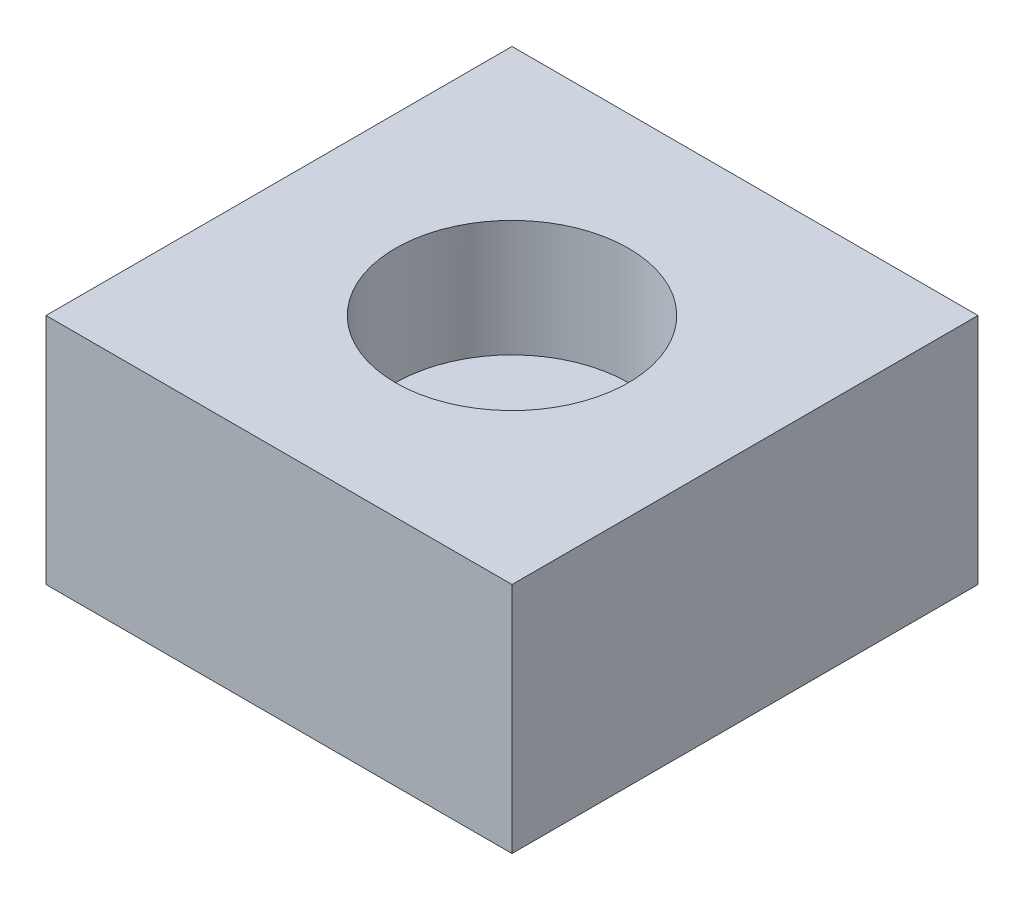
ISO-10303-21;
HEADER;
FILE_DESCRIPTION(('STEP AP214'),'2;1');
FILE_NAME('part.step','',(''),(''),'','','');
FILE_SCHEMA(('AUTOMOTIVE_DESIGN { 1 0 10303 214 1 1 1 1 }'));
ENDSEC;
DATA;
#1=APPLICATION_CONTEXT('core data for automotive mechanical design processes');
#2=APPLICATION_PROTOCOL_DEFINITION('international standard','automotive_design',2000,#1);
#3=PRODUCT_CONTEXT('',#1,'mechanical');
#4=PRODUCT('Part','Part','',(#3));
#5=PRODUCT_RELATED_PRODUCT_CATEGORY('part','',(#4));
#6=PRODUCT_DEFINITION_FORMATION('','',#4);
#7=PRODUCT_DEFINITION_CONTEXT('part definition',#1,'design');
#8=PRODUCT_DEFINITION('design','',#6,#7);
#9=PRODUCT_DEFINITION_SHAPE('','',#8);
#10=(LENGTH_UNIT() NAMED_UNIT(*) SI_UNIT(.MILLI.,.METRE.));
#11=(NAMED_UNIT(*) PLANE_ANGLE_UNIT() SI_UNIT($,.RADIAN.));
#12=(NAMED_UNIT(*) SI_UNIT($,.STERADIAN.) SOLID_ANGLE_UNIT());
#13=UNCERTAINTY_MEASURE_WITH_UNIT(LENGTH_MEASURE(1.E-05),#10,'distance_accuracy_value','');
#14=(GEOMETRIC_REPRESENTATION_CONTEXT(3) GLOBAL_UNCERTAINTY_ASSIGNED_CONTEXT((#13)) GLOBAL_UNIT_ASSIGNED_CONTEXT((#10,
#11,#12)) REPRESENTATION_CONTEXT('',''));
#15=CARTESIAN_POINT('',(0.,0.,0.));
#16=DIRECTION('',(0.,0.,1.));
#17=DIRECTION('',(1.,0.,0.));
#18=AXIS2_PLACEMENT_3D('',#15,#16,#17);
#19=CARTESIAN_POINT('',(1.41168008985061E-13,1000.,0.));
#20=DIRECTION('',(0.,-1.,0.));
#21=DIRECTION('',(0.,0.,-1.));
#22=AXIS2_PLACEMENT_3D('',#19,#20,#21);
#23=CYLINDRICAL_SURFACE('',#22,500.);
#24=CARTESIAN_POINT('',(1.41168008985061E-13,1000.,0.));
#25=DIRECTION('',(0.,1.,0.));
#26=DIRECTION('',(0.,0.,1.));
#27=AXIS2_PLACEMENT_3D('',#24,#25,#26);
#28=CIRCLE('',#27,500.);
#29=CARTESIAN_POINT('',(1.41168008985061E-13,1000.,500.));
#30=VERTEX_POINT('',#29);
#31=EDGE_CURVE('E114',#30,#30,#28,.T.);
#32=ORIENTED_EDGE('',*,*,#31,.T.);
#33=EDGE_LOOP('',(#32));
#34=FACE_BOUND('',#33,.T.);
#35=CARTESIAN_POINT('',(1.41168008985061E-13,500.,0.));
#36=DIRECTION('',(0.,-1.,0.));
#37=DIRECTION('',(0.,0.,-1.));
#38=AXIS2_PLACEMENT_3D('',#35,#36,#37);
#39=CIRCLE('',#38,500.);
#40=CARTESIAN_POINT('',(1.41168008985061E-13,500.,-500.));
#41=VERTEX_POINT('',#40);
#42=EDGE_CURVE('E133',#41,#41,#39,.T.);
#43=ORIENTED_EDGE('',*,*,#42,.T.);
#44=EDGE_LOOP('',(#43));
#45=FACE_BOUND('',#44,.T.);
#46=ADVANCED_FACE('F39',(#34,#45),#23,.F.);
#47=CARTESIAN_POINT('',(0.,1000.,0.));
#48=DIRECTION('',(0.,1.,0.));
#49=DIRECTION('',(0.,0.,1.));
#50=AXIS2_PLACEMENT_3D('',#47,#48,#49);
#51=PLANE('',#50);
#52=DIRECTION('',(0.,0.,-1.));
#53=VECTOR('',#52,1.);
#54=CARTESIAN_POINT('',(1000.,1000.,-1000.));
#55=LINE('',#54,#53);
#56=CARTESIAN_POINT('',(1000.,1000.,1000.));
#57=VERTEX_POINT('',#56);
#58=CARTESIAN_POINT('',(1000.,1000.,-1000.));
#59=VERTEX_POINT('',#58);
#60=EDGE_CURVE('E93',#57,#59,#55,.T.);
#61=ORIENTED_EDGE('',*,*,#60,.T.);
#62=DIRECTION('',(-1.,0.,0.));
#63=VECTOR('',#62,1.);
#64=CARTESIAN_POINT('',(-1000.,1000.,-1000.));
#65=LINE('',#64,#63);
#66=CARTESIAN_POINT('',(-1000.,1000.,-1000.));
#67=VERTEX_POINT('',#66);
#68=EDGE_CURVE('E87',#59,#67,#65,.T.);
#69=ORIENTED_EDGE('',*,*,#68,.T.);
#70=DIRECTION('',(0.,0.,1.));
#71=VECTOR('',#70,1.);
#72=CARTESIAN_POINT('',(-1000.,1000.,-1000.));
#73=LINE('',#72,#71);
#74=CARTESIAN_POINT('',(-1000.,1000.,1000.));
#75=VERTEX_POINT('',#74);
#76=EDGE_CURVE('E91',#67,#75,#73,.T.);
#77=ORIENTED_EDGE('',*,*,#76,.T.);
#78=DIRECTION('',(1.,0.,0.));
#79=VECTOR('',#78,1.);
#80=CARTESIAN_POINT('',(-1000.,1000.,1000.));
#81=LINE('',#80,#79);
#82=EDGE_CURVE('E57',#75,#57,#81,.T.);
#83=ORIENTED_EDGE('',*,*,#82,.T.);
#84=EDGE_LOOP('',(#61,#69,#77,#83));
#85=FACE_BOUND('',#84,.T.);
#86=ORIENTED_EDGE('',*,*,#31,.F.);
#87=EDGE_LOOP('',(#86));
#88=FACE_BOUND('',#87,.T.);
#89=ADVANCED_FACE('F88',(#85,#88),#51,.T.);
#90=CARTESIAN_POINT('',(0.,0.,0.));
#91=DIRECTION('',(0.,1.,0.));
#92=DIRECTION('',(0.,0.,1.));
#93=AXIS2_PLACEMENT_3D('',#90,#91,#92);
#94=PLANE('',#93);
#95=DIRECTION('',(0.,0.,-1.));
#96=VECTOR('',#95,1.);
#97=CARTESIAN_POINT('',(1000.,0.,-1000.));
#98=LINE('',#97,#96);
#99=CARTESIAN_POINT('',(1000.,0.,1000.));
#100=VERTEX_POINT('',#99);
#101=CARTESIAN_POINT('',(1000.,0.,-1000.));
#102=VERTEX_POINT('',#101);
#103=EDGE_CURVE('E110',#100,#102,#98,.T.);
#104=ORIENTED_EDGE('',*,*,#103,.F.);
#105=DIRECTION('',(1.,0.,0.));
#106=VECTOR('',#105,1.);
#107=CARTESIAN_POINT('',(-1000.,0.,1000.));
#108=LINE('',#107,#106);
#109=CARTESIAN_POINT('',(-1000.,0.,1000.));
#110=VERTEX_POINT('',#109);
#111=EDGE_CURVE('E80',#110,#100,#108,.T.);
#112=ORIENTED_EDGE('',*,*,#111,.F.);
#113=DIRECTION('',(0.,0.,1.));
#114=VECTOR('',#113,1.);
#115=CARTESIAN_POINT('',(-1000.,0.,-1000.));
#116=LINE('',#115,#114);
#117=CARTESIAN_POINT('',(-1000.,0.,-1000.));
#118=VERTEX_POINT('',#117);
#119=EDGE_CURVE('E74',#118,#110,#116,.T.);
#120=ORIENTED_EDGE('',*,*,#119,.F.);
#121=DIRECTION('',(-1.,0.,0.));
#122=VECTOR('',#121,1.);
#123=CARTESIAN_POINT('',(-1000.,0.,-1000.));
#124=LINE('',#123,#122);
#125=EDGE_CURVE('E98',#102,#118,#124,.T.);
#126=ORIENTED_EDGE('',*,*,#125,.F.);
#127=EDGE_LOOP('',(#104,#112,#120,#126));
#128=FACE_BOUND('',#127,.T.);
#129=ADVANCED_FACE('F128',(#128),#94,.F.);
#130=CARTESIAN_POINT('',(1000.,1000.,-1000.));
#131=DIRECTION('',(-1.,0.,0.));
#132=DIRECTION('',(0.,0.,1.));
#133=AXIS2_PLACEMENT_3D('',#130,#131,#132);
#134=PLANE('',#133);
#135=ORIENTED_EDGE('',*,*,#103,.T.);
#136=DIRECTION('',(0.,-1.,0.));
#137=VECTOR('',#136,1.);
#138=CARTESIAN_POINT('',(1000.,1000.,-1000.));
#139=LINE('',#138,#137);
#140=EDGE_CURVE('E11',#59,#102,#139,.T.);
#141=ORIENTED_EDGE('',*,*,#140,.F.);
#142=ORIENTED_EDGE('',*,*,#60,.F.);
#143=DIRECTION('',(0.,-1.,0.));
#144=VECTOR('',#143,1.);
#145=CARTESIAN_POINT('',(1000.,1000.,1000.));
#146=LINE('',#145,#144);
#147=EDGE_CURVE('E106',#57,#100,#146,.T.);
#148=ORIENTED_EDGE('',*,*,#147,.T.);
#149=EDGE_LOOP('',(#135,#141,#142,#148));
#150=FACE_BOUND('',#149,.T.);
#151=ADVANCED_FACE('F41',(#150),#134,.F.);
#152=CARTESIAN_POINT('',(-1000.,1000.,-1000.));
#153=DIRECTION('',(0.,0.,1.));
#154=DIRECTION('',(1.,0.,0.));
#155=AXIS2_PLACEMENT_3D('',#152,#153,#154);
#156=PLANE('',#155);
#157=ORIENTED_EDGE('',*,*,#125,.T.);
#158=DIRECTION('',(0.,-1.,0.));
#159=VECTOR('',#158,1.);
#160=CARTESIAN_POINT('',(-1000.,1000.,-1000.));
#161=LINE('',#160,#159);
#162=EDGE_CURVE('E49',#67,#118,#161,.T.);
#163=ORIENTED_EDGE('',*,*,#162,.F.);
#164=ORIENTED_EDGE('',*,*,#68,.F.);
#165=ORIENTED_EDGE('',*,*,#140,.T.);
#166=EDGE_LOOP('',(#157,#163,#164,#165));
#167=FACE_BOUND('',#166,.T.);
#168=ADVANCED_FACE('F97',(#167),#156,.F.);
#169=CARTESIAN_POINT('',(-1000.,1000.,-1000.));
#170=DIRECTION('',(1.,0.,0.));
#171=DIRECTION('',(0.,0.,-1.));
#172=AXIS2_PLACEMENT_3D('',#169,#170,#171);
#173=PLANE('',#172);
#174=ORIENTED_EDGE('',*,*,#119,.T.);
#175=DIRECTION('',(0.,-1.,0.));
#176=VECTOR('',#175,1.);
#177=CARTESIAN_POINT('',(-1000.,1000.,1000.));
#178=LINE('',#177,#176);
#179=EDGE_CURVE('E100',#75,#110,#178,.T.);
#180=ORIENTED_EDGE('',*,*,#179,.F.);
#181=ORIENTED_EDGE('',*,*,#76,.F.);
#182=ORIENTED_EDGE('',*,*,#162,.T.);
#183=EDGE_LOOP('',(#174,#180,#181,#182));
#184=FACE_BOUND('',#183,.T.);
#185=ADVANCED_FACE('F101',(#184),#173,.F.);
#186=CARTESIAN_POINT('',(-1000.,1000.,1000.));
#187=DIRECTION('',(0.,0.,-1.));
#188=DIRECTION('',(-1.,0.,0.));
#189=AXIS2_PLACEMENT_3D('',#186,#187,#188);
#190=PLANE('',#189);
#191=ORIENTED_EDGE('',*,*,#111,.T.);
#192=ORIENTED_EDGE('',*,*,#147,.F.);
#193=ORIENTED_EDGE('',*,*,#82,.F.);
#194=ORIENTED_EDGE('',*,*,#179,.T.);
#195=EDGE_LOOP('',(#191,#192,#193,#194));
#196=FACE_BOUND('',#195,.T.);
#197=ADVANCED_FACE('F125',(#196),#190,.F.);
#198=CARTESIAN_POINT('',(1.41168008985061E-13,500.,0.));
#199=DIRECTION('',(0.,-1.,0.));
#200=DIRECTION('',(0.,0.,-1.));
#201=AXIS2_PLACEMENT_3D('',#198,#199,#200);
#202=PLANE('',#201);
#203=ORIENTED_EDGE('',*,*,#42,.F.);
#204=EDGE_LOOP('',(#203));
#205=FACE_BOUND('',#204,.T.);
#206=ADVANCED_FACE('F139',(#205),#202,.F.);
#207=CLOSED_SHELL('',(#46,#89,#129,#151,#168,#185,#197,#206));
#208=MANIFOLD_SOLID_BREP('B2',#207);
#209=ADVANCED_BREP_SHAPE_REPRESENTATION('',(#18,#208),#14);
#210=SHAPE_DEFINITION_REPRESENTATION(#9,#209);
ENDSEC;
END-ISO-10303-21;
